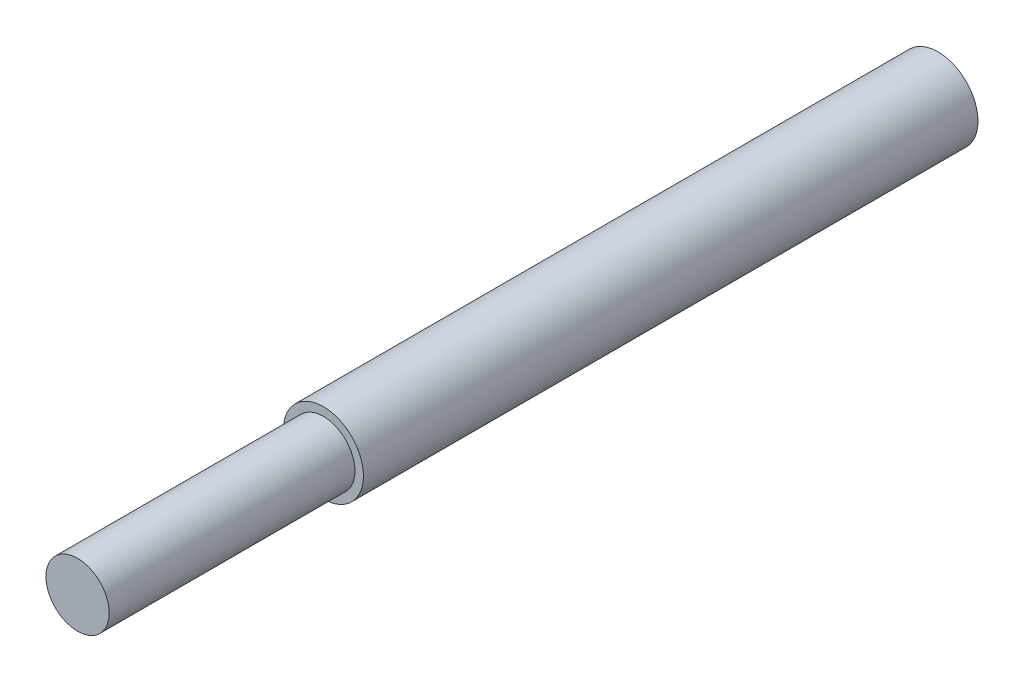
ISO-10303-21;
HEADER;
FILE_DESCRIPTION(('STEP AP214'),'2;1');
FILE_NAME('part.step','',(''),(''),'','','');
FILE_SCHEMA(('AUTOMOTIVE_DESIGN { 1 0 10303 214 1 1 1 1 }'));
ENDSEC;
DATA;
#1=APPLICATION_CONTEXT('core data for automotive mechanical design processes');
#2=APPLICATION_PROTOCOL_DEFINITION('international standard','automotive_design',2000,#1);
#3=PRODUCT_CONTEXT('',#1,'mechanical');
#4=PRODUCT('Part','Part','',(#3));
#5=PRODUCT_RELATED_PRODUCT_CATEGORY('part','',(#4));
#6=PRODUCT_DEFINITION_FORMATION('','',#4);
#7=PRODUCT_DEFINITION_CONTEXT('part definition',#1,'design');
#8=PRODUCT_DEFINITION('design','',#6,#7);
#9=PRODUCT_DEFINITION_SHAPE('','',#8);
#10=(LENGTH_UNIT() NAMED_UNIT(*) SI_UNIT(.MILLI.,.METRE.));
#11=(NAMED_UNIT(*) PLANE_ANGLE_UNIT() SI_UNIT($,.RADIAN.));
#12=(NAMED_UNIT(*) SI_UNIT($,.STERADIAN.) SOLID_ANGLE_UNIT());
#13=UNCERTAINTY_MEASURE_WITH_UNIT(LENGTH_MEASURE(1.E-05),#10,'distance_accuracy_value','');
#14=(GEOMETRIC_REPRESENTATION_CONTEXT(3) GLOBAL_UNCERTAINTY_ASSIGNED_CONTEXT((#13)) GLOBAL_UNIT_ASSIGNED_CONTEXT((#10,
#11,#12)) REPRESENTATION_CONTEXT('',''));
#15=CARTESIAN_POINT('',(0.,0.,0.));
#16=DIRECTION('',(0.,0.,1.));
#17=DIRECTION('',(1.,0.,0.));
#18=AXIS2_PLACEMENT_3D('',#15,#16,#17);
#19=CARTESIAN_POINT('',(0.,0.,0.));
#20=DIRECTION('',(0.,0.,1.));
#21=DIRECTION('',(1.,0.,0.));
#22=AXIS2_PLACEMENT_3D('',#19,#20,#21);
#23=CYLINDRICAL_SURFACE('',#22,1.14);
#24=CARTESIAN_POINT('',(0.,0.,0.));
#25=DIRECTION('',(0.,0.,1.));
#26=DIRECTION('',(1.,0.,0.));
#27=AXIS2_PLACEMENT_3D('',#24,#25,#26);
#28=CIRCLE('',#27,1.14);
#29=CARTESIAN_POINT('',(1.14,0.,0.));
#30=VERTEX_POINT('',#29);
#31=EDGE_CURVE('E10',#30,#30,#28,.T.);
#32=ORIENTED_EDGE('',*,*,#31,.T.);
#33=EDGE_LOOP('',(#32));
#34=FACE_BOUND('',#33,.T.);
#35=CARTESIAN_POINT('',(0.,0.,17.5));
#36=DIRECTION('',(0.,0.,1.));
#37=DIRECTION('',(1.,0.,0.));
#38=AXIS2_PLACEMENT_3D('',#35,#36,#37);
#39=CIRCLE('',#38,1.14);
#40=CARTESIAN_POINT('',(1.14,0.,17.5));
#41=VERTEX_POINT('',#40);
#42=EDGE_CURVE('E37',#41,#41,#39,.T.);
#43=ORIENTED_EDGE('',*,*,#42,.F.);
#44=EDGE_LOOP('',(#43));
#45=FACE_BOUND('',#44,.T.);
#46=ADVANCED_FACE('F31',(#34,#45),#23,.T.);
#47=CARTESIAN_POINT('',(1.14,0.,0.));
#48=DIRECTION('',(0.,0.,-1.));
#49=DIRECTION('',(-1.,0.,0.));
#50=AXIS2_PLACEMENT_3D('',#47,#48,#49);
#51=PLANE('',#50);
#52=ORIENTED_EDGE('',*,*,#31,.F.);
#53=EDGE_LOOP('',(#52));
#54=FACE_BOUND('',#53,.T.);
#55=ADVANCED_FACE('F55',(#54),#51,.T.);
#56=CARTESIAN_POINT('',(0.,0.,17.5));
#57=DIRECTION('',(0.,0.,1.));
#58=DIRECTION('',(1.,0.,0.));
#59=AXIS2_PLACEMENT_3D('',#56,#57,#58);
#60=PLANE('',#59);
#61=CARTESIAN_POINT('',(0.,0.,17.5));
#62=DIRECTION('',(0.,0.,1.));
#63=DIRECTION('',(1.,0.,0.));
#64=AXIS2_PLACEMENT_3D('',#61,#62,#63);
#65=CIRCLE('',#64,0.9);
#66=CARTESIAN_POINT('',(0.9,0.,17.5));
#67=VERTEX_POINT('',#66);
#68=EDGE_CURVE('E45',#67,#67,#65,.T.);
#69=ORIENTED_EDGE('',*,*,#68,.F.);
#70=EDGE_LOOP('',(#69));
#71=FACE_BOUND('',#70,.T.);
#72=ORIENTED_EDGE('',*,*,#42,.T.);
#73=EDGE_LOOP('',(#72));
#74=FACE_BOUND('',#73,.T.);
#75=ADVANCED_FACE('F53',(#71,#74),#60,.T.);
#76=CARTESIAN_POINT('',(0.,0.,24.5));
#77=DIRECTION('',(0.,0.,-1.));
#78=DIRECTION('',(-1.,0.,0.));
#79=AXIS2_PLACEMENT_3D('',#76,#77,#78);
#80=CYLINDRICAL_SURFACE('',#79,0.9);
#81=CARTESIAN_POINT('',(0.,0.,24.5));
#82=DIRECTION('',(0.,0.,1.));
#83=DIRECTION('',(1.,0.,0.));
#84=AXIS2_PLACEMENT_3D('',#81,#82,#83);
#85=CIRCLE('',#84,0.9);
#86=CARTESIAN_POINT('',(0.9,0.,24.5));
#87=VERTEX_POINT('',#86);
#88=EDGE_CURVE('E41',#87,#87,#85,.T.);
#89=ORIENTED_EDGE('',*,*,#88,.F.);
#90=EDGE_LOOP('',(#89));
#91=FACE_BOUND('',#90,.T.);
#92=ORIENTED_EDGE('',*,*,#68,.T.);
#93=EDGE_LOOP('',(#92));
#94=FACE_BOUND('',#93,.T.);
#95=ADVANCED_FACE('F51',(#91,#94),#80,.T.);
#96=CARTESIAN_POINT('',(0.,0.,24.5));
#97=DIRECTION('',(0.,0.,1.));
#98=DIRECTION('',(1.,0.,0.));
#99=AXIS2_PLACEMENT_3D('',#96,#97,#98);
#100=PLANE('',#99);
#101=ORIENTED_EDGE('',*,*,#88,.T.);
#102=EDGE_LOOP('',(#101));
#103=FACE_BOUND('',#102,.T.);
#104=ADVANCED_FACE('F61',(#103),#100,.T.);
#105=CLOSED_SHELL('',(#46,#55,#75,#95,#104));
#106=MANIFOLD_SOLID_BREP('B2',#105);
#107=ADVANCED_BREP_SHAPE_REPRESENTATION('',(#18,#106),#14);
#108=SHAPE_DEFINITION_REPRESENTATION(#9,#107);
ENDSEC;
END-ISO-10303-21;
